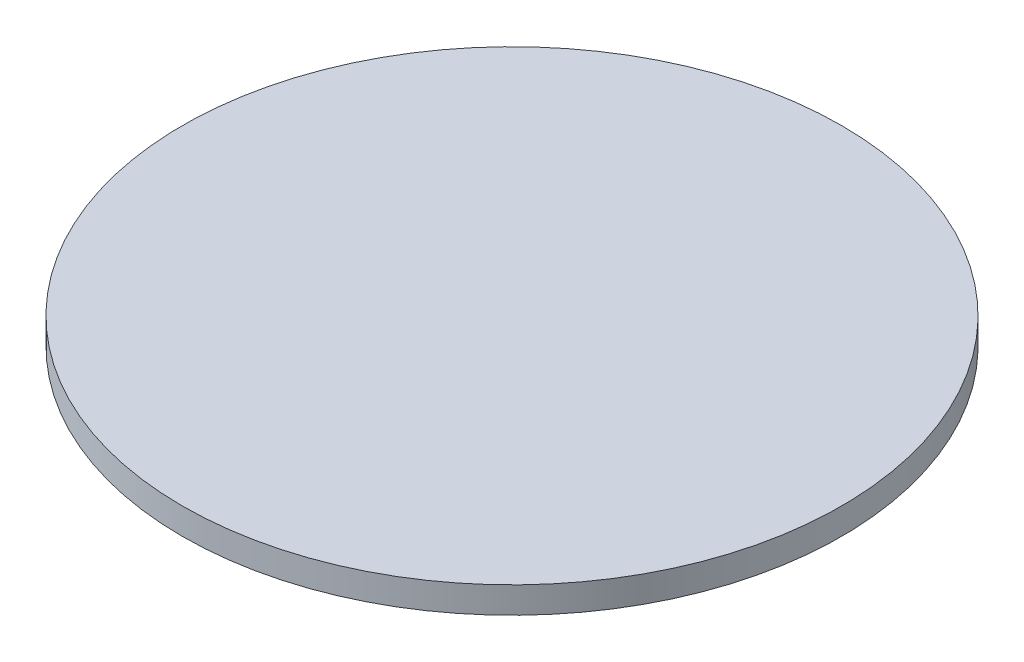
ISO-10303-21;
HEADER;
FILE_DESCRIPTION(('STEP AP214'),'2;1');
FILE_NAME('part.step','',(''),(''),'','','');
FILE_SCHEMA(('AUTOMOTIVE_DESIGN { 1 0 10303 214 1 1 1 1 }'));
ENDSEC;
DATA;
#1=APPLICATION_CONTEXT('core data for automotive mechanical design processes');
#2=APPLICATION_PROTOCOL_DEFINITION('international standard','automotive_design',2000,#1);
#3=PRODUCT_CONTEXT('',#1,'mechanical');
#4=PRODUCT('Part','Part','',(#3));
#5=PRODUCT_RELATED_PRODUCT_CATEGORY('part','',(#4));
#6=PRODUCT_DEFINITION_FORMATION('','',#4);
#7=PRODUCT_DEFINITION_CONTEXT('part definition',#1,'design');
#8=PRODUCT_DEFINITION('design','',#6,#7);
#9=PRODUCT_DEFINITION_SHAPE('','',#8);
#10=(LENGTH_UNIT() NAMED_UNIT(*) SI_UNIT(.MILLI.,.METRE.));
#11=(NAMED_UNIT(*) PLANE_ANGLE_UNIT() SI_UNIT($,.RADIAN.));
#12=(NAMED_UNIT(*) SI_UNIT($,.STERADIAN.) SOLID_ANGLE_UNIT());
#13=UNCERTAINTY_MEASURE_WITH_UNIT(LENGTH_MEASURE(1.E-05),#10,'distance_accuracy_value','');
#14=(GEOMETRIC_REPRESENTATION_CONTEXT(3) GLOBAL_UNCERTAINTY_ASSIGNED_CONTEXT((#13)) GLOBAL_UNIT_ASSIGNED_CONTEXT((#10,
#11,#12)) REPRESENTATION_CONTEXT('',''));
#15=CARTESIAN_POINT('',(0.,0.,0.));
#16=DIRECTION('',(0.,0.,1.));
#17=DIRECTION('',(1.,0.,0.));
#18=AXIS2_PLACEMENT_3D('',#15,#16,#17);
#19=CARTESIAN_POINT('',(0.,1.,0.));
#20=DIRECTION('',(0.,-1.,0.));
#21=DIRECTION('',(0.,0.,-1.));
#22=AXIS2_PLACEMENT_3D('',#19,#20,#21);
#23=CYLINDRICAL_SURFACE('',#22,12.5);
#24=CARTESIAN_POINT('',(0.,1.,0.));
#25=DIRECTION('',(0.,1.,0.));
#26=DIRECTION('',(0.,0.,1.));
#27=AXIS2_PLACEMENT_3D('',#24,#25,#26);
#28=CIRCLE('',#27,12.5);
#29=CARTESIAN_POINT('',(0.,1.,12.5));
#30=VERTEX_POINT('',#29);
#31=EDGE_CURVE('E10',#30,#30,#28,.T.);
#32=ORIENTED_EDGE('',*,*,#31,.F.);
#33=EDGE_LOOP('',(#32));
#34=FACE_BOUND('',#33,.T.);
#35=CARTESIAN_POINT('',(0.,0.,0.));
#36=DIRECTION('',(0.,1.,0.));
#37=DIRECTION('',(0.,0.,1.));
#38=AXIS2_PLACEMENT_3D('',#35,#36,#37);
#39=CIRCLE('',#38,12.5);
#40=CARTESIAN_POINT('',(0.,0.,12.5));
#41=VERTEX_POINT('',#40);
#42=EDGE_CURVE('E40',#41,#41,#39,.T.);
#43=ORIENTED_EDGE('',*,*,#42,.T.);
#44=EDGE_LOOP('',(#43));
#45=FACE_BOUND('',#44,.T.);
#46=ADVANCED_FACE('F37',(#34,#45),#23,.T.);
#47=CARTESIAN_POINT('',(0.,1.,0.));
#48=DIRECTION('',(0.,1.,0.));
#49=DIRECTION('',(0.,0.,1.));
#50=AXIS2_PLACEMENT_3D('',#47,#48,#49);
#51=PLANE('',#50);
#52=ORIENTED_EDGE('',*,*,#31,.T.);
#53=EDGE_LOOP('',(#52));
#54=FACE_BOUND('',#53,.T.);
#55=ADVANCED_FACE('F52',(#54),#51,.T.);
#56=CARTESIAN_POINT('',(0.,0.,0.));
#57=DIRECTION('',(0.,1.,0.));
#58=DIRECTION('',(0.,0.,1.));
#59=AXIS2_PLACEMENT_3D('',#56,#57,#58);
#60=PLANE('',#59);
#61=ORIENTED_EDGE('',*,*,#42,.F.);
#62=EDGE_LOOP('',(#61));
#63=FACE_BOUND('',#62,.T.);
#64=ADVANCED_FACE('F50',(#63),#60,.F.);
#65=CLOSED_SHELL('',(#46,#55,#64));
#66=MANIFOLD_SOLID_BREP('B2',#65);
#67=ADVANCED_BREP_SHAPE_REPRESENTATION('',(#18,#66),#14);
#68=SHAPE_DEFINITION_REPRESENTATION(#9,#67);
ENDSEC;
END-ISO-10303-21;
